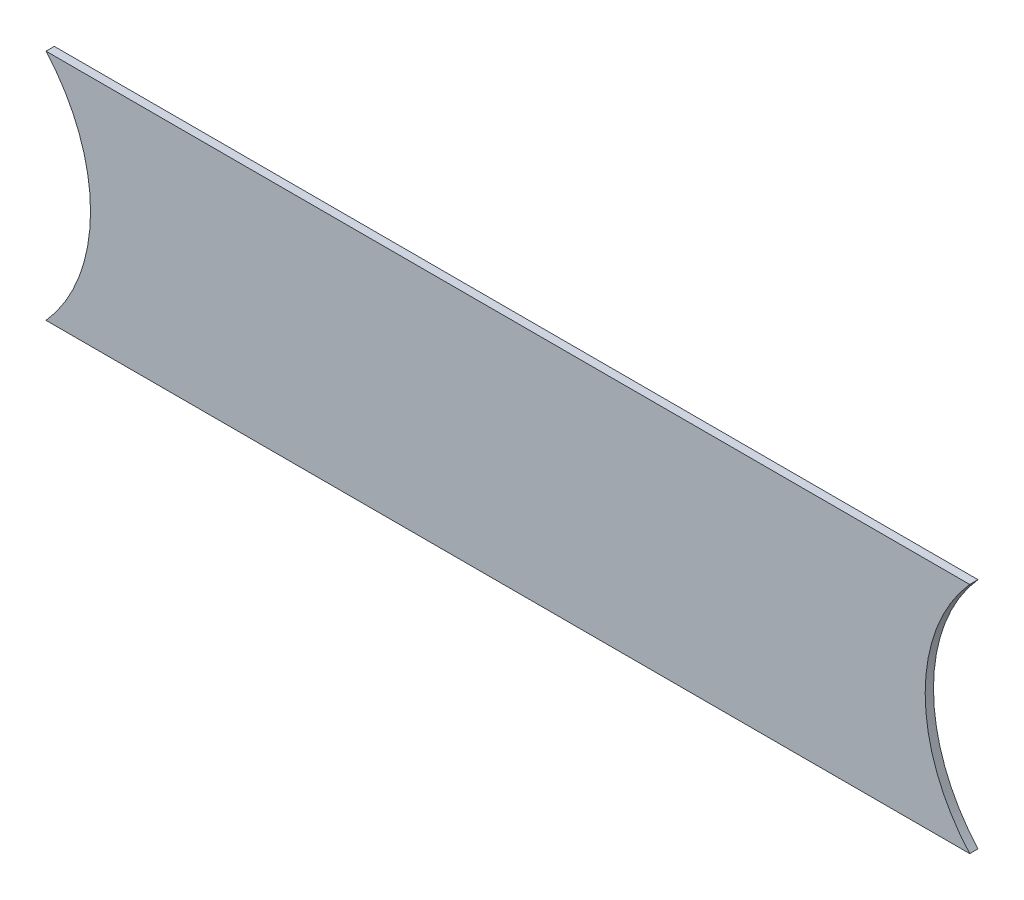
ISO-10303-21;
HEADER;
FILE_DESCRIPTION(('STEP AP214'),'2;1');
FILE_NAME('part.step','',(''),(''),'','','');
FILE_SCHEMA(('AUTOMOTIVE_DESIGN { 1 0 10303 214 1 1 1 1 }'));
ENDSEC;
DATA;
#1=APPLICATION_CONTEXT('core data for automotive mechanical design processes');
#2=APPLICATION_PROTOCOL_DEFINITION('international standard','automotive_design',2000,#1);
#3=PRODUCT_CONTEXT('',#1,'mechanical');
#4=PRODUCT('Part','Part','',(#3));
#5=PRODUCT_RELATED_PRODUCT_CATEGORY('part','',(#4));
#6=PRODUCT_DEFINITION_FORMATION('','',#4);
#7=PRODUCT_DEFINITION_CONTEXT('part definition',#1,'design');
#8=PRODUCT_DEFINITION('design','',#6,#7);
#9=PRODUCT_DEFINITION_SHAPE('','',#8);
#10=(LENGTH_UNIT() NAMED_UNIT(*) SI_UNIT(.MILLI.,.METRE.));
#11=(NAMED_UNIT(*) PLANE_ANGLE_UNIT() SI_UNIT($,.RADIAN.));
#12=(NAMED_UNIT(*) SI_UNIT($,.STERADIAN.) SOLID_ANGLE_UNIT());
#13=UNCERTAINTY_MEASURE_WITH_UNIT(LENGTH_MEASURE(1.E-05),#10,'distance_accuracy_value','');
#14=(GEOMETRIC_REPRESENTATION_CONTEXT(3) GLOBAL_UNCERTAINTY_ASSIGNED_CONTEXT((#13)) GLOBAL_UNIT_ASSIGNED_CONTEXT((#10,
#11,#12)) REPRESENTATION_CONTEXT('',''));
#15=CARTESIAN_POINT('',(0.,0.,0.));
#16=DIRECTION('',(0.,0.,1.));
#17=DIRECTION('',(1.,0.,0.));
#18=AXIS2_PLACEMENT_3D('',#15,#16,#17);
#19=CARTESIAN_POINT('',(78.379027876341,41.9999922,0.));
#20=DIRECTION('',(0.,1.,0.));
#21=DIRECTION('',(1.,0.,0.));
#22=AXIS2_PLACEMENT_3D('',#19,#20,#21);
#23=PLANE('',#22);
#24=DIRECTION('',(1.,0.,0.));
#25=VECTOR('',#24,1.);
#26=CARTESIAN_POINT('',(77.820012,41.9999922,0.03556));
#27=LINE('',#26,#25);
#28=CARTESIAN_POINT('',(78.379027876341,41.9999922,0.03556));
#29=VERTEX_POINT('',#28);
#30=CARTESIAN_POINT('',(82.3409961236591,41.9999922,0.03556));
#31=VERTEX_POINT('',#30);
#32=EDGE_CURVE('E11',#29,#31,#27,.T.);
#33=ORIENTED_EDGE('',*,*,#32,.F.);
#34=DIRECTION('',(0.,0.,1.));
#35=VECTOR('',#34,1.);
#36=CARTESIAN_POINT('',(78.379027876341,41.9999922,0.));
#37=LINE('',#36,#35);
#38=CARTESIAN_POINT('',(78.379027876341,41.9999922,0.));
#39=VERTEX_POINT('',#38);
#40=EDGE_CURVE('E24',#39,#29,#37,.T.);
#41=ORIENTED_EDGE('',*,*,#40,.F.);
#42=DIRECTION('',(1.,0.,0.));
#43=VECTOR('',#42,1.);
#44=CARTESIAN_POINT('',(77.820012,41.9999922,0.));
#45=LINE('',#44,#43);
#46=CARTESIAN_POINT('',(82.3409961236591,41.9999922,0.));
#47=VERTEX_POINT('',#46);
#48=EDGE_CURVE('E82',#39,#47,#45,.T.);
#49=ORIENTED_EDGE('',*,*,#48,.T.);
#50=DIRECTION('',(0.,0.,1.));
#51=VECTOR('',#50,1.);
#52=CARTESIAN_POINT('',(82.3409961236591,41.9999922,0.));
#53=LINE('',#52,#51);
#54=EDGE_CURVE('E37',#47,#31,#53,.T.);
#55=ORIENTED_EDGE('',*,*,#54,.T.);
#56=EDGE_LOOP('',(#33,#41,#49,#55));
#57=FACE_BOUND('',#56,.T.);
#58=ADVANCED_FACE('F17',(#57),#23,.F.);
#59=CARTESIAN_POINT('',(82.900012,42.4999912,0.));
#60=DIRECTION('',(0.,0.,-1.));
#61=DIRECTION('',(1.,0.,0.));
#62=AXIS2_PLACEMENT_3D('',#59,#60,#61);
#63=CYLINDRICAL_SURFACE('',#62,0.7499985);
#64=DIRECTION('',(0.,0.,1.));
#65=VECTOR('',#64,1.);
#66=CARTESIAN_POINT('',(82.3409961236591,42.9999902,0.));
#67=LINE('',#66,#65);
#68=CARTESIAN_POINT('',(82.3409961236591,42.9999902,0.));
#69=VERTEX_POINT('',#68);
#70=CARTESIAN_POINT('',(82.3409961236591,42.9999902,0.03556));
#71=VERTEX_POINT('',#70);
#72=EDGE_CURVE('E97',#69,#71,#67,.T.);
#73=ORIENTED_EDGE('',*,*,#72,.T.);
#74=CARTESIAN_POINT('',(82.900012,42.4999912,0.03556));
#75=DIRECTION('',(0.,0.,1.));
#76=DIRECTION('',(1.,0.,0.));
#77=AXIS2_PLACEMENT_3D('',#74,#75,#76);
#78=CIRCLE('',#77,0.7499985);
#79=EDGE_CURVE('E94',#71,#31,#78,.T.);
#80=ORIENTED_EDGE('',*,*,#79,.T.);
#81=ORIENTED_EDGE('',*,*,#54,.F.);
#82=CARTESIAN_POINT('',(82.900012,42.4999912,0.));
#83=DIRECTION('',(0.,0.,1.));
#84=DIRECTION('',(1.,0.,0.));
#85=AXIS2_PLACEMENT_3D('',#82,#83,#84);
#86=CIRCLE('',#85,0.7499985);
#87=EDGE_CURVE('E92',#69,#47,#86,.T.);
#88=ORIENTED_EDGE('',*,*,#87,.F.);
#89=EDGE_LOOP('',(#73,#80,#81,#88));
#90=FACE_BOUND('',#89,.T.);
#91=ADVANCED_FACE('F102',(#90),#63,.F.);
#92=CARTESIAN_POINT('',(82.3409961236591,42.9999902,0.));
#93=DIRECTION('',(0.,-1.,0.));
#94=DIRECTION('',(-1.,0.,0.));
#95=AXIS2_PLACEMENT_3D('',#92,#93,#94);
#96=PLANE('',#95);
#97=DIRECTION('',(-1.,0.,0.));
#98=VECTOR('',#97,1.);
#99=CARTESIAN_POINT('',(82.900012,42.9999902,0.03556));
#100=LINE('',#99,#98);
#101=CARTESIAN_POINT('',(78.379027876341,42.9999902,0.03556));
#102=VERTEX_POINT('',#101);
#103=EDGE_CURVE('E89',#71,#102,#100,.T.);
#104=ORIENTED_EDGE('',*,*,#103,.F.);
#105=ORIENTED_EDGE('',*,*,#72,.F.);
#106=DIRECTION('',(-1.,0.,0.));
#107=VECTOR('',#106,1.);
#108=CARTESIAN_POINT('',(82.900012,42.9999902,0.));
#109=LINE('',#108,#107);
#110=CARTESIAN_POINT('',(78.379027876341,42.9999902,0.));
#111=VERTEX_POINT('',#110);
#112=EDGE_CURVE('E87',#69,#111,#109,.T.);
#113=ORIENTED_EDGE('',*,*,#112,.T.);
#114=DIRECTION('',(0.,0.,1.));
#115=VECTOR('',#114,1.);
#116=CARTESIAN_POINT('',(78.379027876341,42.9999902,0.));
#117=LINE('',#116,#115);
#118=EDGE_CURVE('E69',#111,#102,#117,.T.);
#119=ORIENTED_EDGE('',*,*,#118,.T.);
#120=EDGE_LOOP('',(#104,#105,#113,#119));
#121=FACE_BOUND('',#120,.T.);
#122=ADVANCED_FACE('F108',(#121),#96,.F.);
#123=CARTESIAN_POINT('',(77.820012,42.4999912,0.));
#124=DIRECTION('',(0.,0.,-1.));
#125=DIRECTION('',(1.,0.,0.));
#126=AXIS2_PLACEMENT_3D('',#123,#124,#125);
#127=CYLINDRICAL_SURFACE('',#126,0.7499985);
#128=DIRECTION('',(0.,0.,1.));
#129=VECTOR('',#128,1.);
#130=CARTESIAN_POINT('',(78.5700105,42.4999912,0.));
#131=LINE('',#130,#129);
#132=CARTESIAN_POINT('',(78.5700105,42.4999912,0.));
#133=VERTEX_POINT('',#132);
#134=CARTESIAN_POINT('',(78.5700105,42.4999912,0.03556));
#135=VERTEX_POINT('',#134);
#136=EDGE_CURVE('E59',#133,#135,#131,.T.);
#137=ORIENTED_EDGE('',*,*,#136,.T.);
#138=CARTESIAN_POINT('',(77.820012,42.4999912,0.03556));
#139=DIRECTION('',(0.,0.,1.));
#140=DIRECTION('',(1.,0.,0.));
#141=AXIS2_PLACEMENT_3D('',#138,#139,#140);
#142=CIRCLE('',#141,0.7499985);
#143=EDGE_CURVE('E70',#135,#102,#142,.T.);
#144=ORIENTED_EDGE('',*,*,#143,.T.);
#145=ORIENTED_EDGE('',*,*,#118,.F.);
#146=CARTESIAN_POINT('',(77.820012,42.4999912,0.));
#147=DIRECTION('',(0.,0.,1.));
#148=DIRECTION('',(1.,0.,0.));
#149=AXIS2_PLACEMENT_3D('',#146,#147,#148);
#150=CIRCLE('',#149,0.7499985);
#151=EDGE_CURVE('E73',#133,#111,#150,.T.);
#152=ORIENTED_EDGE('',*,*,#151,.F.);
#153=EDGE_LOOP('',(#137,#144,#145,#152));
#154=FACE_BOUND('',#153,.T.);
#155=ADVANCED_FACE('F74',(#154),#127,.F.);
#156=CARTESIAN_POINT('',(77.820012,42.4999912,0.));
#157=DIRECTION('',(0.,0.,-1.));
#158=DIRECTION('',(1.,0.,0.));
#159=AXIS2_PLACEMENT_3D('',#156,#157,#158);
#160=CYLINDRICAL_SURFACE('',#159,0.7499985);
#161=ORIENTED_EDGE('',*,*,#40,.T.);
#162=CARTESIAN_POINT('',(77.820012,42.4999912,0.03556));
#163=DIRECTION('',(0.,0.,1.));
#164=DIRECTION('',(1.,0.,0.));
#165=AXIS2_PLACEMENT_3D('',#162,#163,#164);
#166=CIRCLE('',#165,0.7499985);
#167=EDGE_CURVE('E65',#29,#135,#166,.T.);
#168=ORIENTED_EDGE('',*,*,#167,.T.);
#169=ORIENTED_EDGE('',*,*,#136,.F.);
#170=EDGE_CURVE('E63',#39,#133,#150,.T.);
#171=ORIENTED_EDGE('',*,*,#170,.F.);
#172=EDGE_LOOP('',(#161,#168,#169,#171));
#173=FACE_BOUND('',#172,.T.);
#174=ADVANCED_FACE('F61',(#173),#160,.F.);
#175=CARTESIAN_POINT('',(77.820012,41.9999922,0.));
#176=DIRECTION('',(0.,0.,-1.));
#177=DIRECTION('',(-1.,0.,0.));
#178=AXIS2_PLACEMENT_3D('',#175,#176,#177);
#179=PLANE('',#178);
#180=ORIENTED_EDGE('',*,*,#48,.F.);
#181=ORIENTED_EDGE('',*,*,#170,.T.);
#182=ORIENTED_EDGE('',*,*,#151,.T.);
#183=ORIENTED_EDGE('',*,*,#112,.F.);
#184=ORIENTED_EDGE('',*,*,#87,.T.);
#185=EDGE_LOOP('',(#180,#181,#182,#183,#184));
#186=FACE_BOUND('',#185,.T.);
#187=ADVANCED_FACE('F80',(#186),#179,.T.);
#188=CARTESIAN_POINT('',(77.820012,41.9999922,0.03556));
#189=DIRECTION('',(0.,0.,-1.));
#190=DIRECTION('',(-1.,0.,0.));
#191=AXIS2_PLACEMENT_3D('',#188,#189,#190);
#192=PLANE('',#191);
#193=ORIENTED_EDGE('',*,*,#167,.F.);
#194=ORIENTED_EDGE('',*,*,#32,.T.);
#195=ORIENTED_EDGE('',*,*,#79,.F.);
#196=ORIENTED_EDGE('',*,*,#103,.T.);
#197=ORIENTED_EDGE('',*,*,#143,.F.);
#198=EDGE_LOOP('',(#193,#194,#195,#196,#197));
#199=FACE_BOUND('',#198,.T.);
#200=ADVANCED_FACE('F106',(#199),#192,.F.);
#201=CLOSED_SHELL('',(#58,#91,#122,#155,#174,#187,#200));
#202=MANIFOLD_SOLID_BREP('B1',#201);
#203=ADVANCED_BREP_SHAPE_REPRESENTATION('',(#18,#202),#14);
#204=SHAPE_DEFINITION_REPRESENTATION(#9,#203);
ENDSEC;
END-ISO-10303-21;
